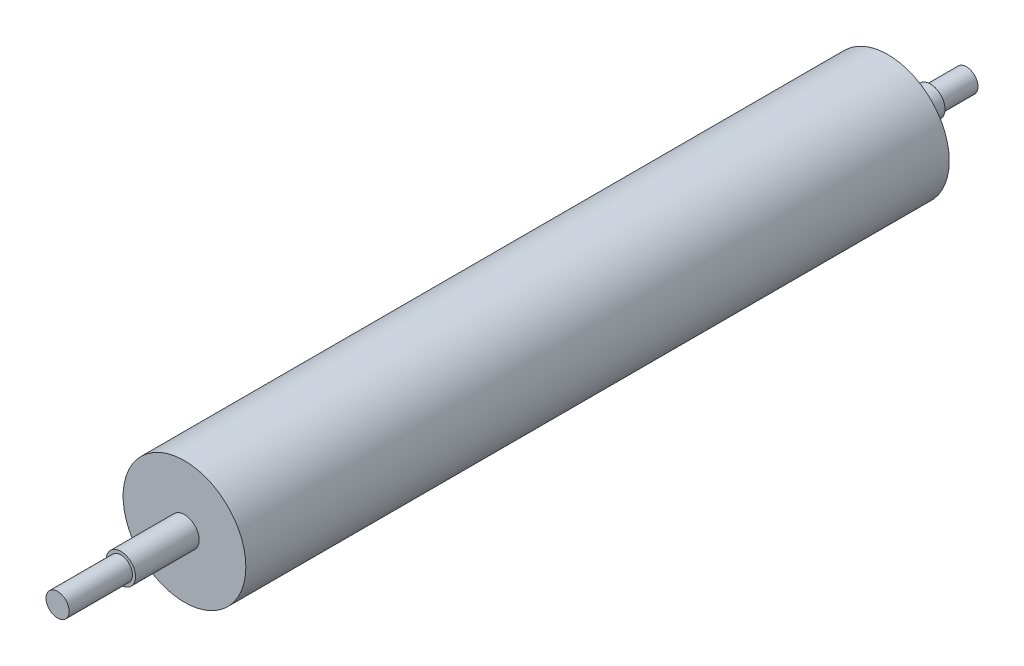
ISO-10303-21;
HEADER;
FILE_DESCRIPTION(('STEP AP214'),'2;1');
FILE_NAME('part.step','',(''),(''),'','','');
FILE_SCHEMA(('AUTOMOTIVE_DESIGN { 1 0 10303 214 1 1 1 1 }'));
ENDSEC;
DATA;
#1=APPLICATION_CONTEXT('core data for automotive mechanical design processes');
#2=APPLICATION_PROTOCOL_DEFINITION('international standard','automotive_design',2000,#1);
#3=PRODUCT_CONTEXT('',#1,'mechanical');
#4=PRODUCT('Part','Part','',(#3));
#5=PRODUCT_RELATED_PRODUCT_CATEGORY('part','',(#4));
#6=PRODUCT_DEFINITION_FORMATION('','',#4);
#7=PRODUCT_DEFINITION_CONTEXT('part definition',#1,'design');
#8=PRODUCT_DEFINITION('design','',#6,#7);
#9=PRODUCT_DEFINITION_SHAPE('','',#8);
#10=(LENGTH_UNIT() NAMED_UNIT(*) SI_UNIT(.MILLI.,.METRE.));
#11=(NAMED_UNIT(*) PLANE_ANGLE_UNIT() SI_UNIT($,.RADIAN.));
#12=(NAMED_UNIT(*) SI_UNIT($,.STERADIAN.) SOLID_ANGLE_UNIT());
#13=UNCERTAINTY_MEASURE_WITH_UNIT(LENGTH_MEASURE(1.E-05),#10,'distance_accuracy_value','');
#14=(GEOMETRIC_REPRESENTATION_CONTEXT(3) GLOBAL_UNCERTAINTY_ASSIGNED_CONTEXT((#13)) GLOBAL_UNIT_ASSIGNED_CONTEXT((#10,
#11,#12)) REPRESENTATION_CONTEXT('',''));
#15=CARTESIAN_POINT('',(0.,0.,0.));
#16=DIRECTION('',(0.,0.,1.));
#17=DIRECTION('',(1.,0.,0.));
#18=AXIS2_PLACEMENT_3D('',#15,#16,#17);
#19=CARTESIAN_POINT('',(0.,0.,240.));
#20=DIRECTION('',(0.,0.,-1.));
#21=DIRECTION('',(-1.,0.,0.));
#22=AXIS2_PLACEMENT_3D('',#19,#20,#21);
#23=CYLINDRICAL_SURFACE('',#22,20.94);
#24=CARTESIAN_POINT('',(0.,0.,240.));
#25=DIRECTION('',(0.,0.,1.));
#26=DIRECTION('',(1.,0.,0.));
#27=AXIS2_PLACEMENT_3D('',#24,#25,#26);
#28=CIRCLE('',#27,20.94);
#29=CARTESIAN_POINT('',(20.94,0.,240.));
#30=VERTEX_POINT('',#29);
#31=EDGE_CURVE('E45',#30,#30,#28,.T.);
#32=ORIENTED_EDGE('',*,*,#31,.F.);
#33=EDGE_LOOP('',(#32));
#34=FACE_BOUND('',#33,.T.);
#35=CARTESIAN_POINT('',(0.,0.,0.));
#36=DIRECTION('',(0.,0.,1.));
#37=DIRECTION('',(1.,0.,0.));
#38=AXIS2_PLACEMENT_3D('',#35,#36,#37);
#39=CIRCLE('',#38,20.94);
#40=CARTESIAN_POINT('',(20.94,0.,0.));
#41=VERTEX_POINT('',#40);
#42=EDGE_CURVE('E36',#41,#41,#39,.T.);
#43=ORIENTED_EDGE('',*,*,#42,.T.);
#44=EDGE_LOOP('',(#43));
#45=FACE_BOUND('',#44,.T.);
#46=ADVANCED_FACE('F33',(#34,#45),#23,.T.);
#47=CARTESIAN_POINT('',(0.,0.,240.));
#48=DIRECTION('',(0.,0.,1.));
#49=DIRECTION('',(1.,0.,0.));
#50=AXIS2_PLACEMENT_3D('',#47,#48,#49);
#51=PLANE('',#50);
#52=CARTESIAN_POINT('',(0.,0.,240.));
#53=DIRECTION('',(0.,0.,1.));
#54=DIRECTION('',(1.,0.,0.));
#55=AXIS2_PLACEMENT_3D('',#52,#53,#54);
#56=CIRCLE('',#55,5.);
#57=CARTESIAN_POINT('',(5.,0.,240.));
#58=VERTEX_POINT('',#57);
#59=EDGE_CURVE('E40',#58,#58,#56,.T.);
#60=ORIENTED_EDGE('',*,*,#59,.F.);
#61=EDGE_LOOP('',(#60));
#62=FACE_BOUND('',#61,.T.);
#63=ORIENTED_EDGE('',*,*,#31,.T.);
#64=EDGE_LOOP('',(#63));
#65=FACE_BOUND('',#64,.T.);
#66=ADVANCED_FACE('F74',(#62,#65),#51,.T.);
#67=CARTESIAN_POINT('',(0.,0.,0.));
#68=DIRECTION('',(0.,0.,1.));
#69=DIRECTION('',(1.,0.,0.));
#70=AXIS2_PLACEMENT_3D('',#67,#68,#69);
#71=PLANE('',#70);
#72=CARTESIAN_POINT('',(0.,0.,0.));
#73=DIRECTION('',(0.,0.,1.));
#74=DIRECTION('',(1.,0.,0.));
#75=AXIS2_PLACEMENT_3D('',#72,#73,#74);
#76=CIRCLE('',#75,5.);
#77=CARTESIAN_POINT('',(5.,0.,0.));
#78=VERTEX_POINT('',#77);
#79=EDGE_CURVE('E57',#78,#78,#76,.T.);
#80=ORIENTED_EDGE('',*,*,#79,.T.);
#81=EDGE_LOOP('',(#80));
#82=FACE_BOUND('',#81,.T.);
#83=ORIENTED_EDGE('',*,*,#42,.F.);
#84=EDGE_LOOP('',(#83));
#85=FACE_BOUND('',#84,.T.);
#86=ADVANCED_FACE('F71',(#82,#85),#71,.F.);
#87=CARTESIAN_POINT('',(0.,0.,-14.5));
#88=DIRECTION('',(0.,0.,1.));
#89=DIRECTION('',(1.,0.,0.));
#90=AXIS2_PLACEMENT_3D('',#87,#88,#89);
#91=CYLINDRICAL_SURFACE('',#90,5.);
#92=CARTESIAN_POINT('',(0.,0.,-14.5));
#93=DIRECTION('',(0.,0.,1.));
#94=DIRECTION('',(1.,0.,0.));
#95=AXIS2_PLACEMENT_3D('',#92,#93,#94);
#96=CIRCLE('',#95,5.);
#97=CARTESIAN_POINT('',(5.,0.,-14.5));
#98=VERTEX_POINT('',#97);
#99=EDGE_CURVE('E60',#98,#98,#96,.T.);
#100=CARTESIAN_POINT('',(5.,0.,-14.5));
#101=CARTESIAN_POINT('',(5.,0.,-14.3489583333333));
#102=CARTESIAN_POINT('',(5.,0.,-14.1979166666667));
#103=CARTESIAN_POINT('',(5.,0.,-13.8958333333333));
#104=CARTESIAN_POINT('',(5.,0.,-13.7447916666667));
#105=CARTESIAN_POINT('',(5.,0.,-13.4427083333333));
#106=CARTESIAN_POINT('',(5.,0.,-13.2916666666667));
#107=CARTESIAN_POINT('',(5.,0.,-12.9895833333333));
#108=CARTESIAN_POINT('',(5.,0.,-12.8385416666667));
#109=CARTESIAN_POINT('',(5.,0.,-12.5364583333333));
#110=CARTESIAN_POINT('',(5.,0.,-12.3854166666667));
#111=CARTESIAN_POINT('',(5.,0.,-12.0833333333333));
#112=CARTESIAN_POINT('',(5.,0.,-11.9322916666667));
#113=CARTESIAN_POINT('',(5.,0.,-11.6302083333333));
#114=CARTESIAN_POINT('',(5.,0.,-11.4791666666667));
#115=CARTESIAN_POINT('',(5.,0.,-11.1770833333333));
#116=CARTESIAN_POINT('',(5.,0.,-11.0260416666667));
#117=CARTESIAN_POINT('',(5.,0.,-10.7239583333333));
#118=CARTESIAN_POINT('',(5.,0.,-10.5729166666667));
#119=CARTESIAN_POINT('',(5.,0.,-10.2708333333333));
#120=CARTESIAN_POINT('',(5.,0.,-10.1197916666667));
#121=CARTESIAN_POINT('',(5.,0.,-9.81770833333333));
#122=CARTESIAN_POINT('',(5.,0.,-9.66666666666667));
#123=CARTESIAN_POINT('',(5.,0.,-9.36458333333333));
#124=CARTESIAN_POINT('',(5.,0.,-9.21354166666667));
#125=CARTESIAN_POINT('',(5.,0.,-8.91145833333334));
#126=CARTESIAN_POINT('',(5.,0.,-8.76041666666667));
#127=CARTESIAN_POINT('',(5.,0.,-8.45833333333334));
#128=CARTESIAN_POINT('',(5.,0.,-8.30729166666667));
#129=CARTESIAN_POINT('',(5.,0.,-8.00520833333333));
#130=CARTESIAN_POINT('',(5.,0.,-7.85416666666667));
#131=CARTESIAN_POINT('',(5.,0.,-7.55208333333333));
#132=CARTESIAN_POINT('',(5.,0.,-7.40104166666667));
#133=CARTESIAN_POINT('',(5.,0.,-7.09895833333333));
#134=CARTESIAN_POINT('',(5.,0.,-6.94791666666667));
#135=CARTESIAN_POINT('',(5.,0.,-6.64583333333333));
#136=CARTESIAN_POINT('',(5.,0.,-6.49479166666667));
#137=CARTESIAN_POINT('',(5.,0.,-6.19270833333333));
#138=CARTESIAN_POINT('',(5.,0.,-6.04166666666667));
#139=CARTESIAN_POINT('',(5.,0.,-5.73958333333333));
#140=CARTESIAN_POINT('',(5.,0.,-5.58854166666667));
#141=CARTESIAN_POINT('',(5.,0.,-5.28645833333333));
#142=CARTESIAN_POINT('',(5.,0.,-5.13541666666667));
#143=CARTESIAN_POINT('',(5.,0.,-4.83333333333333));
#144=CARTESIAN_POINT('',(5.,0.,-4.68229166666667));
#145=CARTESIAN_POINT('',(5.,0.,-4.38020833333333));
#146=CARTESIAN_POINT('',(5.,0.,-4.22916666666667));
#147=CARTESIAN_POINT('',(5.,0.,-3.92708333333333));
#148=CARTESIAN_POINT('',(5.,0.,-3.77604166666667));
#149=CARTESIAN_POINT('',(5.,0.,-3.47395833333333));
#150=CARTESIAN_POINT('',(5.,0.,-3.32291666666667));
#151=CARTESIAN_POINT('',(5.,0.,-3.02083333333333));
#152=CARTESIAN_POINT('',(5.,0.,-2.86979166666667));
#153=CARTESIAN_POINT('',(5.,0.,-2.56770833333333));
#154=CARTESIAN_POINT('',(5.,0.,-2.41666666666667));
#155=CARTESIAN_POINT('',(5.,0.,-2.11458333333333));
#156=CARTESIAN_POINT('',(5.,0.,-1.96354166666667));
#157=CARTESIAN_POINT('',(5.,0.,-1.66145833333333));
#158=CARTESIAN_POINT('',(5.,0.,-1.51041666666667));
#159=CARTESIAN_POINT('',(5.,0.,-1.20833333333333));
#160=CARTESIAN_POINT('',(5.,0.,-1.05729166666667));
#161=CARTESIAN_POINT('',(5.,0.,-0.755208333333334));
#162=CARTESIAN_POINT('',(5.,0.,-0.604166666666667));
#163=CARTESIAN_POINT('',(5.,0.,-0.302083333333333));
#164=CARTESIAN_POINT('',(5.,0.,-0.151041666666667));
#165=CARTESIAN_POINT('',(5.,0.,0.));
#166=B_SPLINE_CURVE_WITH_KNOTS('',3,(#100,#101,#102,#103,#104,#105,#106,#107,#108,#109,#110,
#111,#112,#113,#114,#115,#116,#117,#118,#119,#120,#121,#122,#123,#124,#125,#126,#127,#128,#129,
#130,#131,#132,#133,#134,#135,#136,#137,#138,#139,#140,#141,#142,#143,#144,#145,#146,#147,#148,
#149,#150,#151,#152,#153,#154,#155,#156,#157,#158,#159,#160,#161,#162,#163,#164,#165),
.UNSPECIFIED.,.F.,.F.,(4,2,2,2,2,2,2,2,2,2,2,2,2,2,2,2,2,2,2,2,2,2,2,2,2,2,2,2,2,2,2,2,4),(0.,
0.453124999999999,0.906249999999999,1.359375,1.8125,2.265625,2.71875,3.171875,3.625,4.078125,
4.53125,4.984375,5.4375,5.890625,6.34375,6.796875,7.25,7.703125,8.15625,8.609375,9.0625,
9.515625,9.96875,10.421875,10.875,11.328125,11.78125,12.234375,12.6875,13.140625,13.59375,
14.046875,14.5),.UNSPECIFIED.);
#167=EDGE_CURVE('BSEAM73',#98,#78,#166,.T.);
#168=ORIENTED_EDGE('',*,*,#99,.T.);
#169=ORIENTED_EDGE('',*,*,#79,.F.);
#170=ORIENTED_EDGE('',*,*,#167,.T.);
#171=ORIENTED_EDGE('',*,*,#167,.F.);
#172=EDGE_LOOP('',(#168,#170,#169,#171));
#173=FACE_BOUND('',#172,.T.);
#174=ADVANCED_FACE('F73',(#173),#91,.T.);
#175=CARTESIAN_POINT('',(0.,0.,-14.5));
#176=DIRECTION('',(0.,0.,1.));
#177=DIRECTION('',(1.,0.,0.));
#178=AXIS2_PLACEMENT_3D('',#175,#176,#177);
#179=PLANE('',#178);
#180=CARTESIAN_POINT('',(0.,0.,-14.5));
#181=DIRECTION('',(0.,0.,1.));
#182=DIRECTION('',(1.,0.,0.));
#183=AXIS2_PLACEMENT_3D('',#180,#181,#182);
#184=CIRCLE('',#183,3.95);
#185=CARTESIAN_POINT('',(3.95,0.,-14.5));
#186=VERTEX_POINT('',#185);
#187=EDGE_CURVE('E52',#186,#186,#184,.T.);
#188=ORIENTED_EDGE('',*,*,#187,.T.);
#189=EDGE_LOOP('',(#188));
#190=FACE_BOUND('',#189,.T.);
#191=ORIENTED_EDGE('',*,*,#99,.F.);
#192=EDGE_LOOP('',(#191));
#193=FACE_BOUND('',#192,.T.);
#194=ADVANCED_FACE('F80',(#190,#193),#179,.F.);
#195=CARTESIAN_POINT('',(0.,0.,-26.8));
#196=DIRECTION('',(0.,0.,1.));
#197=DIRECTION('',(1.,0.,0.));
#198=AXIS2_PLACEMENT_3D('',#195,#196,#197);
#199=CYLINDRICAL_SURFACE('',#198,3.95);
#200=CARTESIAN_POINT('',(0.,0.,-26.8));
#201=DIRECTION('',(0.,0.,1.));
#202=DIRECTION('',(1.,0.,0.));
#203=AXIS2_PLACEMENT_3D('',#200,#201,#202);
#204=CIRCLE('',#203,3.95);
#205=CARTESIAN_POINT('',(3.95,0.,-26.8));
#206=VERTEX_POINT('',#205);
#207=EDGE_CURVE('E54',#206,#206,#204,.T.);
#208=ORIENTED_EDGE('',*,*,#207,.T.);
#209=EDGE_LOOP('',(#208));
#210=FACE_BOUND('',#209,.T.);
#211=ORIENTED_EDGE('',*,*,#187,.F.);
#212=EDGE_LOOP('',(#211));
#213=FACE_BOUND('',#212,.T.);
#214=ADVANCED_FACE('F147',(#210,#213),#199,.T.);
#215=CARTESIAN_POINT('',(0.,0.,-26.8));
#216=DIRECTION('',(0.,0.,1.));
#217=DIRECTION('',(1.,0.,0.));
#218=AXIS2_PLACEMENT_3D('',#215,#216,#217);
#219=PLANE('',#218);
#220=ORIENTED_EDGE('',*,*,#207,.F.);
#221=EDGE_LOOP('',(#220));
#222=FACE_BOUND('',#221,.T.);
#223=ADVANCED_FACE('F100',(#222),#219,.F.);
#224=CARTESIAN_POINT('',(0.,0.,261.7));
#225=DIRECTION('',(0.,0.,-1.));
#226=DIRECTION('',(-1.,0.,0.));
#227=AXIS2_PLACEMENT_3D('',#224,#225,#226);
#228=CYLINDRICAL_SURFACE('',#227,5.);
#229=CARTESIAN_POINT('',(0.,0.,261.7));
#230=DIRECTION('',(0.,0.,1.));
#231=DIRECTION('',(1.,0.,0.));
#232=AXIS2_PLACEMENT_3D('',#229,#230,#231);
#233=CIRCLE('',#232,5.);
#234=CARTESIAN_POINT('',(5.,0.,261.7));
#235=VERTEX_POINT('',#234);
#236=EDGE_CURVE('E50',#235,#235,#233,.T.);
#237=ORIENTED_EDGE('',*,*,#236,.F.);
#238=EDGE_LOOP('',(#237));
#239=FACE_BOUND('',#238,.T.);
#240=ORIENTED_EDGE('',*,*,#59,.T.);
#241=EDGE_LOOP('',(#240));
#242=FACE_BOUND('',#241,.T.);
#243=ADVANCED_FACE('F105',(#239,#242),#228,.T.);
#244=CARTESIAN_POINT('',(0.,0.,261.7));
#245=DIRECTION('',(0.,0.,1.));
#246=DIRECTION('',(1.,0.,0.));
#247=AXIS2_PLACEMENT_3D('',#244,#245,#246);
#248=PLANE('',#247);
#249=CARTESIAN_POINT('',(0.,0.,261.7));
#250=DIRECTION('',(0.,0.,1.));
#251=DIRECTION('',(1.,0.,0.));
#252=AXIS2_PLACEMENT_3D('',#249,#250,#251);
#253=CIRCLE('',#252,3.95);
#254=CARTESIAN_POINT('',(-3.95,0.,261.7));
#255=VERTEX_POINT('',#254);
#256=EDGE_CURVE('E10',#255,#255,#253,.T.);
#257=ORIENTED_EDGE('',*,*,#256,.F.);
#258=EDGE_LOOP('',(#257));
#259=FACE_BOUND('',#258,.T.);
#260=ORIENTED_EDGE('',*,*,#236,.T.);
#261=EDGE_LOOP('',(#260));
#262=FACE_BOUND('',#261,.T.);
#263=ADVANCED_FACE('F110',(#259,#262),#248,.T.);
#264=CARTESIAN_POINT('',(0.,0.,283.3));
#265=DIRECTION('',(0.,0.,-1.));
#266=DIRECTION('',(-1.,0.,0.));
#267=AXIS2_PLACEMENT_3D('',#264,#265,#266);
#268=CYLINDRICAL_SURFACE('',#267,3.95);
#269=CARTESIAN_POINT('',(0.,0.,283.3));
#270=DIRECTION('',(0.,0.,1.));
#271=DIRECTION('',(1.,0.,0.));
#272=AXIS2_PLACEMENT_3D('',#269,#270,#271);
#273=CIRCLE('',#272,3.95);
#274=CARTESIAN_POINT('',(-3.95,0.,283.3));
#275=VERTEX_POINT('',#274);
#276=EDGE_CURVE('E49',#275,#275,#273,.T.);
#277=CARTESIAN_POINT('',(-3.95,0.,283.3));
#278=CARTESIAN_POINT('',(-3.95,0.,283.075));
#279=CARTESIAN_POINT('',(-3.95,0.,282.85));
#280=CARTESIAN_POINT('',(-3.95,0.,282.4));
#281=CARTESIAN_POINT('',(-3.95,0.,282.175));
#282=CARTESIAN_POINT('',(-3.95,0.,281.725));
#283=CARTESIAN_POINT('',(-3.95,0.,281.5));
#284=CARTESIAN_POINT('',(-3.95,0.,281.05));
#285=CARTESIAN_POINT('',(-3.95,0.,280.825));
#286=CARTESIAN_POINT('',(-3.95,0.,280.375));
#287=CARTESIAN_POINT('',(-3.95,0.,280.15));
#288=CARTESIAN_POINT('',(-3.95,0.,279.7));
#289=CARTESIAN_POINT('',(-3.95,0.,279.475));
#290=CARTESIAN_POINT('',(-3.95,0.,279.025));
#291=CARTESIAN_POINT('',(-3.95,0.,278.8));
#292=CARTESIAN_POINT('',(-3.95,0.,278.35));
#293=CARTESIAN_POINT('',(-3.95,0.,278.125));
#294=CARTESIAN_POINT('',(-3.95,0.,277.675));
#295=CARTESIAN_POINT('',(-3.95,0.,277.45));
#296=CARTESIAN_POINT('',(-3.95,0.,277.));
#297=CARTESIAN_POINT('',(-3.95,0.,276.775));
#298=CARTESIAN_POINT('',(-3.95,0.,276.325));
#299=CARTESIAN_POINT('',(-3.95,0.,276.1));
#300=CARTESIAN_POINT('',(-3.95,0.,275.65));
#301=CARTESIAN_POINT('',(-3.95,0.,275.425));
#302=CARTESIAN_POINT('',(-3.95,0.,274.975));
#303=CARTESIAN_POINT('',(-3.95,0.,274.75));
#304=CARTESIAN_POINT('',(-3.95,0.,274.3));
#305=CARTESIAN_POINT('',(-3.95,0.,274.075));
#306=CARTESIAN_POINT('',(-3.95,0.,273.625));
#307=CARTESIAN_POINT('',(-3.95,0.,273.4));
#308=CARTESIAN_POINT('',(-3.95,0.,272.95));
#309=CARTESIAN_POINT('',(-3.95,0.,272.725));
#310=CARTESIAN_POINT('',(-3.95,0.,272.275));
#311=CARTESIAN_POINT('',(-3.95,0.,272.05));
#312=CARTESIAN_POINT('',(-3.95,0.,271.6));
#313=CARTESIAN_POINT('',(-3.95,0.,271.375));
#314=CARTESIAN_POINT('',(-3.95,0.,270.925));
#315=CARTESIAN_POINT('',(-3.95,0.,270.7));
#316=CARTESIAN_POINT('',(-3.95,0.,270.25));
#317=CARTESIAN_POINT('',(-3.95,0.,270.025));
#318=CARTESIAN_POINT('',(-3.95,0.,269.575));
#319=CARTESIAN_POINT('',(-3.95,0.,269.35));
#320=CARTESIAN_POINT('',(-3.95,0.,268.9));
#321=CARTESIAN_POINT('',(-3.95,0.,268.675));
#322=CARTESIAN_POINT('',(-3.95,0.,268.225));
#323=CARTESIAN_POINT('',(-3.95,0.,268.));
#324=CARTESIAN_POINT('',(-3.95,0.,267.55));
#325=CARTESIAN_POINT('',(-3.95,0.,267.325));
#326=CARTESIAN_POINT('',(-3.95,0.,266.875));
#327=CARTESIAN_POINT('',(-3.95,0.,266.65));
#328=CARTESIAN_POINT('',(-3.95,0.,266.2));
#329=CARTESIAN_POINT('',(-3.95,0.,265.975));
#330=CARTESIAN_POINT('',(-3.95,0.,265.525));
#331=CARTESIAN_POINT('',(-3.95,0.,265.3));
#332=CARTESIAN_POINT('',(-3.95,0.,264.85));
#333=CARTESIAN_POINT('',(-3.95,0.,264.625));
#334=CARTESIAN_POINT('',(-3.95,0.,264.175));
#335=CARTESIAN_POINT('',(-3.95,0.,263.95));
#336=CARTESIAN_POINT('',(-3.95,0.,263.5));
#337=CARTESIAN_POINT('',(-3.95,0.,263.275));
#338=CARTESIAN_POINT('',(-3.95,0.,262.825));
#339=CARTESIAN_POINT('',(-3.95,0.,262.6));
#340=CARTESIAN_POINT('',(-3.95,0.,262.15));
#341=CARTESIAN_POINT('',(-3.95,0.,261.925));
#342=CARTESIAN_POINT('',(-3.95,0.,261.7));
#343=B_SPLINE_CURVE_WITH_KNOTS('',3,(#277,#278,#279,#280,#281,#282,#283,#284,#285,#286,#287,
#288,#289,#290,#291,#292,#293,#294,#295,#296,#297,#298,#299,#300,#301,#302,#303,#304,#305,#306,
#307,#308,#309,#310,#311,#312,#313,#314,#315,#316,#317,#318,#319,#320,#321,#322,#323,#324,#325,
#326,#327,#328,#329,#330,#331,#332,#333,#334,#335,#336,#337,#338,#339,#340,#341,#342),
.UNSPECIFIED.,.F.,.F.,(4,2,2,2,2,2,2,2,2,2,2,2,2,2,2,2,2,2,2,2,2,2,2,2,2,2,2,2,2,2,2,2,4),(0.,
0.675000000000037,1.35000000000002,2.02500000000005,2.70000000000004,3.37500000000002,
4.05000000000005,4.72500000000004,5.40000000000002,6.07500000000005,6.75000000000003,
7.42500000000001,8.10000000000005,8.77500000000003,9.45000000000001,10.125,10.8,11.475,
12.1500000000001,12.825,13.5,14.175,14.85,15.525,16.2,16.875,17.55,18.225,18.9,19.575,20.25,
20.925,21.6),.UNSPECIFIED.);
#344=EDGE_CURVE('BSEAM120',#275,#255,#343,.T.);
#345=ORIENTED_EDGE('',*,*,#276,.F.);
#346=ORIENTED_EDGE('',*,*,#256,.T.);
#347=ORIENTED_EDGE('',*,*,#344,.T.);
#348=ORIENTED_EDGE('',*,*,#344,.F.);
#349=EDGE_LOOP('',(#345,#347,#346,#348));
#350=FACE_BOUND('',#349,.T.);
#351=ADVANCED_FACE('F120',(#350),#268,.T.);
#352=CARTESIAN_POINT('',(0.,0.,283.3));
#353=DIRECTION('',(0.,0.,1.));
#354=DIRECTION('',(1.,0.,0.));
#355=AXIS2_PLACEMENT_3D('',#352,#353,#354);
#356=PLANE('',#355);
#357=ORIENTED_EDGE('',*,*,#276,.T.);
#358=EDGE_LOOP('',(#357));
#359=FACE_BOUND('',#358,.T.);
#360=ADVANCED_FACE('F130',(#359),#356,.T.);
#361=CLOSED_SHELL('',(#46,#66,#86,#174,#194,#214,#223,#243,#263,#351,#360));
#362=MANIFOLD_SOLID_BREP('B2',#361);
#363=ADVANCED_BREP_SHAPE_REPRESENTATION('',(#18,#362),#14);
#364=SHAPE_DEFINITION_REPRESENTATION(#9,#363);
ENDSEC;
END-ISO-10303-21;
